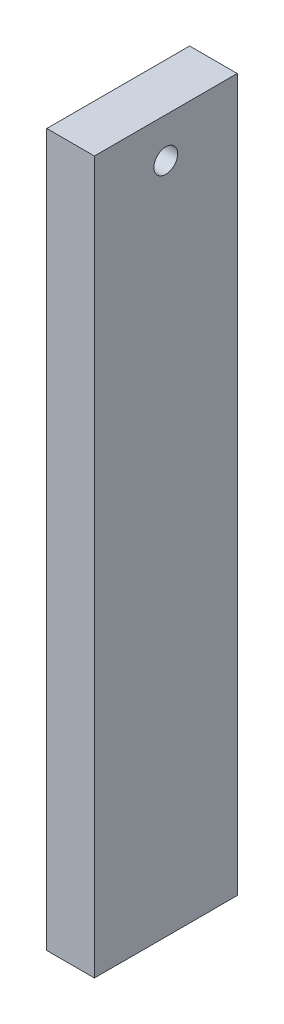
ISO-10303-21;
HEADER;
FILE_DESCRIPTION(('STEP AP214'),'2;1');
FILE_NAME('part.step','',(''),(''),'','','');
FILE_SCHEMA(('AUTOMOTIVE_DESIGN { 1 0 10303 214 1 1 1 1 }'));
ENDSEC;
DATA;
#1=APPLICATION_CONTEXT('core data for automotive mechanical design processes');
#2=APPLICATION_PROTOCOL_DEFINITION('international standard','automotive_design',2000,#1);
#3=PRODUCT_CONTEXT('',#1,'mechanical');
#4=PRODUCT('Part','Part','',(#3));
#5=PRODUCT_RELATED_PRODUCT_CATEGORY('part','',(#4));
#6=PRODUCT_DEFINITION_FORMATION('','',#4);
#7=PRODUCT_DEFINITION_CONTEXT('part definition',#1,'design');
#8=PRODUCT_DEFINITION('design','',#6,#7);
#9=PRODUCT_DEFINITION_SHAPE('','',#8);
#10=(LENGTH_UNIT() NAMED_UNIT(*) SI_UNIT(.MILLI.,.METRE.));
#11=(NAMED_UNIT(*) PLANE_ANGLE_UNIT() SI_UNIT($,.RADIAN.));
#12=(NAMED_UNIT(*) SI_UNIT($,.STERADIAN.) SOLID_ANGLE_UNIT());
#13=UNCERTAINTY_MEASURE_WITH_UNIT(LENGTH_MEASURE(1.E-05),#10,'distance_accuracy_value','');
#14=(GEOMETRIC_REPRESENTATION_CONTEXT(3) GLOBAL_UNCERTAINTY_ASSIGNED_CONTEXT((#13)) GLOBAL_UNIT_ASSIGNED_CONTEXT((#10,
#11,#12)) REPRESENTATION_CONTEXT('',''));
#15=CARTESIAN_POINT('',(0.,0.,0.));
#16=DIRECTION('',(0.,0.,1.));
#17=DIRECTION('',(1.,0.,0.));
#18=AXIS2_PLACEMENT_3D('',#15,#16,#17);
#19=CARTESIAN_POINT('',(-0.533569661574905,0.89168623623554,4.));
#20=DIRECTION('',(1.,0.,0.));
#21=DIRECTION('',(0.,0.,-1.));
#22=AXIS2_PLACEMENT_3D('',#19,#20,#21);
#23=PLANE('',#22);
#24=CARTESIAN_POINT('',(-0.533569661574913,22.2257366665746,2.));
#25=DIRECTION('',(1.,0.,0.));
#26=DIRECTION('',(0.,1.,0.));
#27=AXIS2_PLACEMENT_3D('',#24,#25,#26);
#28=CIRCLE('',#27,0.5);
#29=CARTESIAN_POINT('',(-0.533569661574913,22.7257366665746,2.));
#30=VERTEX_POINT('',#29);
#31=EDGE_CURVE('E132',#30,#30,#28,.T.);
#32=ORIENTED_EDGE('',*,*,#31,.T.);
#33=EDGE_LOOP('',(#32));
#34=FACE_BOUND('',#33,.T.);
#35=DIRECTION('',(0.,-1.,0.));
#36=VECTOR('',#35,1.);
#37=CARTESIAN_POINT('',(-0.533569661574905,0.89168623623554,4.));
#38=LINE('',#37,#36);
#39=CARTESIAN_POINT('',(-0.533569661574905,-6.0034033819183,4.));
#40=VERTEX_POINT('',#39);
#41=CARTESIAN_POINT('',(-0.533569661574905,-6.00642947171113,4.));
#42=VERTEX_POINT('',#41);
#43=EDGE_CURVE('E147',#40,#42,#38,.T.);
#44=ORIENTED_EDGE('',*,*,#43,.F.);
#45=DIRECTION('',(0.,0.,-1.));
#46=VECTOR('',#45,1.);
#47=CARTESIAN_POINT('',(-0.533569661574905,-6.0034033819183,0.));
#48=LINE('',#47,#46);
#49=CARTESIAN_POINT('',(-0.533569661574905,-6.0034033819183,5.));
#50=VERTEX_POINT('',#49);
#51=EDGE_CURVE('E123',#50,#40,#48,.T.);
#52=ORIENTED_EDGE('',*,*,#51,.F.);
#53=DIRECTION('',(0.,-1.,0.));
#54=VECTOR('',#53,1.);
#55=CARTESIAN_POINT('',(-0.533569661574906,0.,5.));
#56=LINE('',#55,#54);
#57=CARTESIAN_POINT('',(-0.533569661574909,23.8916862362355,5.));
#58=VERTEX_POINT('',#57);
#59=EDGE_CURVE('E115',#58,#50,#56,.T.);
#60=ORIENTED_EDGE('',*,*,#59,.F.);
#61=DIRECTION('',(0.,0.,1.));
#62=VECTOR('',#61,1.);
#63=CARTESIAN_POINT('',(-0.533569661574905,23.8916862362355,0.));
#64=LINE('',#63,#62);
#65=CARTESIAN_POINT('',(-0.533569661574909,23.8916862362355,-1.));
#66=VERTEX_POINT('',#65);
#67=EDGE_CURVE('E99',#66,#58,#64,.T.);
#68=ORIENTED_EDGE('',*,*,#67,.F.);
#69=DIRECTION('',(0.,-1.,0.));
#70=VECTOR('',#69,1.);
#71=CARTESIAN_POINT('',(-0.533569661574906,0.,-1.));
#72=LINE('',#71,#70);
#73=CARTESIAN_POINT('',(-0.533569661574905,-6.0034033819183,-1.));
#74=VERTEX_POINT('',#73);
#75=EDGE_CURVE('E119',#66,#74,#72,.T.);
#76=ORIENTED_EDGE('',*,*,#75,.T.);
#77=CARTESIAN_POINT('',(-0.533569661574905,-6.0034033819183,0.));
#78=VERTEX_POINT('',#77);
#79=EDGE_CURVE('E124',#78,#74,#48,.T.);
#80=ORIENTED_EDGE('',*,*,#79,.F.);
#81=DIRECTION('',(0.,-1.,0.));
#82=VECTOR('',#81,1.);
#83=CARTESIAN_POINT('',(-0.533569661574905,0.89168623623554,0.));
#84=LINE('',#83,#82);
#85=CARTESIAN_POINT('',(-0.533569661574905,-6.00642947171113,0.));
#86=VERTEX_POINT('',#85);
#87=EDGE_CURVE('E146',#78,#86,#84,.T.);
#88=ORIENTED_EDGE('',*,*,#87,.T.);
#89=DIRECTION('',(0.,0.,-1.));
#90=VECTOR('',#89,1.);
#91=CARTESIAN_POINT('',(-0.533569661574905,-6.00642947171113,4.));
#92=LINE('',#91,#90);
#93=EDGE_CURVE('E44',#42,#86,#92,.T.);
#94=ORIENTED_EDGE('',*,*,#93,.F.);
#95=EDGE_LOOP('',(#44,#52,#60,#68,#76,#80,#88,#94));
#96=FACE_BOUND('',#95,.T.);
#97=ADVANCED_FACE('F36',(#34,#96),#23,.F.);
#98=CARTESIAN_POINT('',(-0.533569661574905,-6.00642947171113,4.));
#99=DIRECTION('',(0.,1.,0.));
#100=DIRECTION('',(0.,0.,1.));
#101=AXIS2_PLACEMENT_3D('',#98,#99,#100);
#102=PLANE('',#101);
#103=DIRECTION('',(1.,0.,0.));
#104=VECTOR('',#103,1.);
#105=CARTESIAN_POINT('',(-0.533569661574905,-6.00642947171113,0.));
#106=LINE('',#105,#104);
#107=CARTESIAN_POINT('',(1.4664303384251,-6.00642947171113,0.));
#108=VERTEX_POINT('',#107);
#109=EDGE_CURVE('E155',#86,#108,#106,.T.);
#110=ORIENTED_EDGE('',*,*,#109,.T.);
#111=DIRECTION('',(0.,0.,-1.));
#112=VECTOR('',#111,1.);
#113=CARTESIAN_POINT('',(1.4664303384251,-6.00642947171113,4.));
#114=LINE('',#113,#112);
#115=CARTESIAN_POINT('',(1.4664303384251,-6.00642947171113,4.));
#116=VERTEX_POINT('',#115);
#117=EDGE_CURVE('E153',#116,#108,#114,.T.);
#118=ORIENTED_EDGE('',*,*,#117,.F.);
#119=DIRECTION('',(1.,0.,0.));
#120=VECTOR('',#119,1.);
#121=CARTESIAN_POINT('',(-0.533569661574905,-6.00642947171113,4.));
#122=LINE('',#121,#120);
#123=EDGE_CURVE('E149',#42,#116,#122,.T.);
#124=ORIENTED_EDGE('',*,*,#123,.F.);
#125=ORIENTED_EDGE('',*,*,#93,.T.);
#126=EDGE_LOOP('',(#110,#118,#124,#125));
#127=FACE_BOUND('',#126,.T.);
#128=ADVANCED_FACE('F165',(#127),#102,.F.);
#129=CARTESIAN_POINT('',(1.46643033842509,0.89168623623554,4.));
#130=DIRECTION('',(-1.,0.,0.));
#131=DIRECTION('',(0.,-1.,0.));
#132=AXIS2_PLACEMENT_3D('',#129,#130,#131);
#133=PLANE('',#132);
#134=CARTESIAN_POINT('',(1.46643033842509,22.2257366665746,2.));
#135=DIRECTION('',(-1.,0.,0.));
#136=DIRECTION('',(0.,-1.,0.));
#137=AXIS2_PLACEMENT_3D('',#134,#135,#136);
#138=CIRCLE('',#137,0.5);
#139=CARTESIAN_POINT('',(1.46643033842509,21.7257366665746,2.));
#140=VERTEX_POINT('',#139);
#141=EDGE_CURVE('E39',#140,#140,#138,.T.);
#142=ORIENTED_EDGE('',*,*,#141,.T.);
#143=EDGE_LOOP('',(#142));
#144=FACE_BOUND('',#143,.T.);
#145=DIRECTION('',(0.,1.,0.));
#146=VECTOR('',#145,1.);
#147=CARTESIAN_POINT('',(1.46643033842509,0.89168623623554,0.));
#148=LINE('',#147,#146);
#149=CARTESIAN_POINT('',(1.4664303384251,-6.0034033819183,0.));
#150=VERTEX_POINT('',#149);
#151=EDGE_CURVE('E150',#108,#150,#148,.T.);
#152=ORIENTED_EDGE('',*,*,#151,.T.);
#153=DIRECTION('',(0.,0.,-1.));
#154=VECTOR('',#153,1.);
#155=CARTESIAN_POINT('',(1.4664303384251,-6.0034033819183,0.));
#156=LINE('',#155,#154);
#157=CARTESIAN_POINT('',(1.4664303384251,-6.0034033819183,-1.));
#158=VERTEX_POINT('',#157);
#159=EDGE_CURVE('E136',#150,#158,#156,.T.);
#160=ORIENTED_EDGE('',*,*,#159,.T.);
#161=DIRECTION('',(0.,-1.,0.));
#162=VECTOR('',#161,1.);
#163=CARTESIAN_POINT('',(1.46643033842509,0.,-1.));
#164=LINE('',#163,#162);
#165=CARTESIAN_POINT('',(1.46643033842509,23.8916862362355,-1.));
#166=VERTEX_POINT('',#165);
#167=EDGE_CURVE('E125',#166,#158,#164,.T.);
#168=ORIENTED_EDGE('',*,*,#167,.F.);
#169=DIRECTION('',(0.,0.,-1.));
#170=VECTOR('',#169,1.);
#171=CARTESIAN_POINT('',(1.46643033842509,23.8916862362355,0.));
#172=LINE('',#171,#170);
#173=CARTESIAN_POINT('',(1.46643033842509,23.8916862362355,5.));
#174=VERTEX_POINT('',#173);
#175=EDGE_CURVE('E110',#174,#166,#172,.T.);
#176=ORIENTED_EDGE('',*,*,#175,.F.);
#177=DIRECTION('',(0.,-1.,0.));
#178=VECTOR('',#177,1.);
#179=CARTESIAN_POINT('',(1.46643033842509,0.,5.));
#180=LINE('',#179,#178);
#181=CARTESIAN_POINT('',(1.4664303384251,-6.0034033819183,5.));
#182=VERTEX_POINT('',#181);
#183=EDGE_CURVE('E117',#174,#182,#180,.T.);
#184=ORIENTED_EDGE('',*,*,#183,.T.);
#185=CARTESIAN_POINT('',(1.4664303384251,-6.0034033819183,4.));
#186=VERTEX_POINT('',#185);
#187=EDGE_CURVE('E129',#182,#186,#156,.T.);
#188=ORIENTED_EDGE('',*,*,#187,.T.);
#189=DIRECTION('',(0.,1.,0.));
#190=VECTOR('',#189,1.);
#191=CARTESIAN_POINT('',(1.46643033842509,0.89168623623554,4.));
#192=LINE('',#191,#190);
#193=EDGE_CURVE('E51',#116,#186,#192,.T.);
#194=ORIENTED_EDGE('',*,*,#193,.F.);
#195=ORIENTED_EDGE('',*,*,#117,.T.);
#196=EDGE_LOOP('',(#152,#160,#168,#176,#184,#188,#194,#195));
#197=FACE_BOUND('',#196,.T.);
#198=ADVANCED_FACE('F174',(#144,#197),#133,.F.);
#199=CARTESIAN_POINT('',(0.,0.,4.));
#200=DIRECTION('',(0.,0.,1.));
#201=DIRECTION('',(1.,0.,0.));
#202=AXIS2_PLACEMENT_3D('',#199,#200,#201);
#203=PLANE('',#202);
#204=DIRECTION('',(1.,0.,0.));
#205=VECTOR('',#204,1.);
#206=CARTESIAN_POINT('',(0.,-6.0034033819183,4.));
#207=LINE('',#206,#205);
#208=EDGE_CURVE('E55',#40,#186,#207,.T.);
#209=ORIENTED_EDGE('',*,*,#208,.F.);
#210=ORIENTED_EDGE('',*,*,#43,.T.);
#211=ORIENTED_EDGE('',*,*,#123,.T.);
#212=ORIENTED_EDGE('',*,*,#193,.T.);
#213=EDGE_LOOP('',(#209,#210,#211,#212));
#214=FACE_BOUND('',#213,.T.);
#215=ADVANCED_FACE('F217',(#214),#203,.T.);
#216=CARTESIAN_POINT('',(0.,0.,0.));
#217=DIRECTION('',(0.,0.,1.));
#218=DIRECTION('',(1.,0.,0.));
#219=AXIS2_PLACEMENT_3D('',#216,#217,#218);
#220=PLANE('',#219);
#221=ORIENTED_EDGE('',*,*,#87,.F.);
#222=DIRECTION('',(1.,0.,0.));
#223=VECTOR('',#222,1.);
#224=CARTESIAN_POINT('',(0.,-6.0034033819183,0.));
#225=LINE('',#224,#223);
#226=EDGE_CURVE('E11',#78,#150,#225,.T.);
#227=ORIENTED_EDGE('',*,*,#226,.T.);
#228=ORIENTED_EDGE('',*,*,#151,.F.);
#229=ORIENTED_EDGE('',*,*,#109,.F.);
#230=EDGE_LOOP('',(#221,#227,#228,#229));
#231=FACE_BOUND('',#230,.T.);
#232=ADVANCED_FACE('F172',(#231),#220,.F.);
#233=CARTESIAN_POINT('',(0.,23.8916862362355,0.));
#234=DIRECTION('',(0.,1.,0.));
#235=DIRECTION('',(0.,0.,1.));
#236=AXIS2_PLACEMENT_3D('',#233,#234,#235);
#237=PLANE('',#236);
#238=ORIENTED_EDGE('',*,*,#67,.T.);
#239=DIRECTION('',(1.,0.,0.));
#240=VECTOR('',#239,1.);
#241=CARTESIAN_POINT('',(-0.533569661574909,23.8916862362355,5.));
#242=LINE('',#241,#240);
#243=EDGE_CURVE('E102',#58,#174,#242,.T.);
#244=ORIENTED_EDGE('',*,*,#243,.T.);
#245=ORIENTED_EDGE('',*,*,#175,.T.);
#246=DIRECTION('',(1.,0.,0.));
#247=VECTOR('',#246,1.);
#248=CARTESIAN_POINT('',(-0.533569661574909,23.8916862362355,-1.));
#249=LINE('',#248,#247);
#250=EDGE_CURVE('E105',#66,#166,#249,.T.);
#251=ORIENTED_EDGE('',*,*,#250,.F.);
#252=EDGE_LOOP('',(#238,#244,#245,#251));
#253=FACE_BOUND('',#252,.T.);
#254=ADVANCED_FACE('F101',(#253),#237,.T.);
#255=CARTESIAN_POINT('',(-0.533569661574906,0.,-1.));
#256=DIRECTION('',(0.,0.,1.));
#257=DIRECTION('',(1.,0.,0.));
#258=AXIS2_PLACEMENT_3D('',#255,#256,#257);
#259=PLANE('',#258);
#260=ORIENTED_EDGE('',*,*,#167,.T.);
#261=DIRECTION('',(1.,0.,0.));
#262=VECTOR('',#261,1.);
#263=CARTESIAN_POINT('',(-0.533569661574905,-6.0034033819183,-1.));
#264=LINE('',#263,#262);
#265=EDGE_CURVE('E140',#74,#158,#264,.T.);
#266=ORIENTED_EDGE('',*,*,#265,.F.);
#267=ORIENTED_EDGE('',*,*,#75,.F.);
#268=ORIENTED_EDGE('',*,*,#250,.T.);
#269=EDGE_LOOP('',(#260,#266,#267,#268));
#270=FACE_BOUND('',#269,.T.);
#271=ADVANCED_FACE('F188',(#270),#259,.F.);
#272=CARTESIAN_POINT('',(-0.533569661574905,-6.0034033819183,0.));
#273=DIRECTION('',(0.,-1.,0.));
#274=DIRECTION('',(1.,0.,0.));
#275=AXIS2_PLACEMENT_3D('',#272,#273,#274);
#276=PLANE('',#275);
#277=ORIENTED_EDGE('',*,*,#226,.F.);
#278=ORIENTED_EDGE('',*,*,#79,.T.);
#279=ORIENTED_EDGE('',*,*,#265,.T.);
#280=ORIENTED_EDGE('',*,*,#159,.F.);
#281=EDGE_LOOP('',(#277,#278,#279,#280));
#282=FACE_BOUND('',#281,.T.);
#283=ADVANCED_FACE('F180',(#282),#276,.T.);
#284=ORIENTED_EDGE('',*,*,#51,.T.);
#285=ORIENTED_EDGE('',*,*,#208,.T.);
#286=ORIENTED_EDGE('',*,*,#187,.F.);
#287=DIRECTION('',(1.,0.,0.));
#288=VECTOR('',#287,1.);
#289=CARTESIAN_POINT('',(-0.533569661574905,-6.0034033819183,5.));
#290=LINE('',#289,#288);
#291=EDGE_CURVE('E118',#50,#182,#290,.T.);
#292=ORIENTED_EDGE('',*,*,#291,.F.);
#293=EDGE_LOOP('',(#284,#285,#286,#292));
#294=FACE_BOUND('',#293,.T.);
#295=ADVANCED_FACE('F178',(#294),#276,.T.);
#296=CARTESIAN_POINT('',(-0.533569661574906,0.,5.));
#297=DIRECTION('',(0.,0.,1.));
#298=DIRECTION('',(1.,0.,0.));
#299=AXIS2_PLACEMENT_3D('',#296,#297,#298);
#300=PLANE('',#299);
#301=ORIENTED_EDGE('',*,*,#183,.F.);
#302=ORIENTED_EDGE('',*,*,#243,.F.);
#303=ORIENTED_EDGE('',*,*,#59,.T.);
#304=ORIENTED_EDGE('',*,*,#291,.T.);
#305=EDGE_LOOP('',(#301,#302,#303,#304));
#306=FACE_BOUND('',#305,.T.);
#307=ADVANCED_FACE('F114',(#306),#300,.T.);
#308=CARTESIAN_POINT('',(-0.533569661574913,22.2257366665746,2.));
#309=DIRECTION('',(1.,0.,0.));
#310=DIRECTION('',(0.,1.,0.));
#311=AXIS2_PLACEMENT_3D('',#308,#309,#310);
#312=CYLINDRICAL_SURFACE('',#311,0.5);
#313=ORIENTED_EDGE('',*,*,#31,.F.);
#314=EDGE_LOOP('',(#313));
#315=FACE_BOUND('',#314,.T.);
#316=ORIENTED_EDGE('',*,*,#141,.F.);
#317=EDGE_LOOP('',(#316));
#318=FACE_BOUND('',#317,.T.);
#319=ADVANCED_FACE('F186',(#315,#318),#312,.F.);
#320=CLOSED_SHELL('',(#97,#128,#198,#215,#232,#254,#271,#283,#295,#307,#319));
#321=MANIFOLD_SOLID_BREP('B2',#320);
#322=ADVANCED_BREP_SHAPE_REPRESENTATION('',(#18,#321),#14);
#323=SHAPE_DEFINITION_REPRESENTATION(#9,#322);
ENDSEC;
END-ISO-10303-21;
